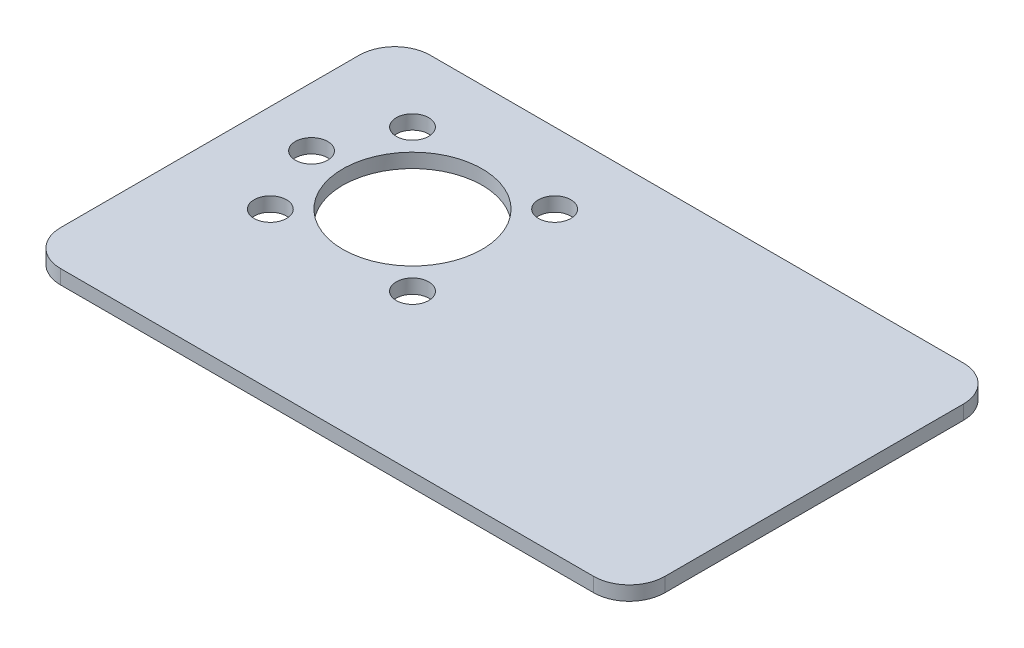
ISO-10303-21;
HEADER;
FILE_DESCRIPTION(('STEP AP214'),'2;1');
FILE_NAME('part.step','',(''),(''),'','','');
FILE_SCHEMA(('AUTOMOTIVE_DESIGN { 1 0 10303 214 1 1 1 1 }'));
ENDSEC;
DATA;
#1=APPLICATION_CONTEXT('core data for automotive mechanical design processes');
#2=APPLICATION_PROTOCOL_DEFINITION('international standard','automotive_design',2000,#1);
#3=PRODUCT_CONTEXT('',#1,'mechanical');
#4=PRODUCT('Part','Part','',(#3));
#5=PRODUCT_RELATED_PRODUCT_CATEGORY('part','',(#4));
#6=PRODUCT_DEFINITION_FORMATION('','',#4);
#7=PRODUCT_DEFINITION_CONTEXT('part definition',#1,'design');
#8=PRODUCT_DEFINITION('design','',#6,#7);
#9=PRODUCT_DEFINITION_SHAPE('','',#8);
#10=(LENGTH_UNIT() NAMED_UNIT(*) SI_UNIT(.MILLI.,.METRE.));
#11=(NAMED_UNIT(*) PLANE_ANGLE_UNIT() SI_UNIT($,.RADIAN.));
#12=(NAMED_UNIT(*) SI_UNIT($,.STERADIAN.) SOLID_ANGLE_UNIT());
#13=UNCERTAINTY_MEASURE_WITH_UNIT(LENGTH_MEASURE(1.E-05),#10,'distance_accuracy_value','');
#14=(GEOMETRIC_REPRESENTATION_CONTEXT(3) GLOBAL_UNCERTAINTY_ASSIGNED_CONTEXT((#13)) GLOBAL_UNIT_ASSIGNED_CONTEXT((#10,
#11,#12)) REPRESENTATION_CONTEXT('',''));
#15=CARTESIAN_POINT('',(0.,0.,0.));
#16=DIRECTION('',(0.,0.,1.));
#17=DIRECTION('',(1.,0.,0.));
#18=AXIS2_PLACEMENT_3D('',#15,#16,#17);
#19=CARTESIAN_POINT('',(0.,2.54,0.));
#20=DIRECTION('',(0.,-1.,0.));
#21=DIRECTION('',(0.,0.,-1.));
#22=AXIS2_PLACEMENT_3D('',#19,#20,#21);
#23=PLANE('',#22);
#24=CARTESIAN_POINT('',(28.575,2.54,-40.64));
#25=DIRECTION('',(0.,1.,0.));
#26=DIRECTION('',(0.,0.,1.));
#27=AXIS2_PLACEMENT_3D('',#24,#25,#26);
#28=CIRCLE('',#27,12.4587);
#29=CARTESIAN_POINT('',(28.575,2.54,-28.1813));
#30=VERTEX_POINT('',#29);
#31=EDGE_CURVE('E214',#30,#30,#28,.T.);
#32=ORIENTED_EDGE('',*,*,#31,.F.);
#33=EDGE_LOOP('',(#32));
#34=FACE_BOUND('',#33,.T.);
#35=CARTESIAN_POINT('',(15.875,2.54,-53.34));
#36=DIRECTION('',(0.,1.,0.));
#37=DIRECTION('',(0.,0.,1.));
#38=AXIS2_PLACEMENT_3D('',#35,#36,#37);
#39=CIRCLE('',#38,2.9);
#40=CARTESIAN_POINT('',(15.875,2.54,-50.44));
#41=VERTEX_POINT('',#40);
#42=EDGE_CURVE('E208',#41,#41,#39,.T.);
#43=ORIENTED_EDGE('',*,*,#42,.F.);
#44=EDGE_LOOP('',(#43));
#45=FACE_BOUND('',#44,.T.);
#46=DIRECTION('',(0.,0.,1.));
#47=VECTOR('',#46,1.);
#48=CARTESIAN_POINT('',(0.,2.54,0.));
#49=LINE('',#48,#47);
#50=CARTESIAN_POINT('',(0.,2.54,-59.69));
#51=VERTEX_POINT('',#50);
#52=CARTESIAN_POINT('',(0.,2.54,-6.35));
#53=VERTEX_POINT('',#52);
#54=EDGE_CURVE('E142',#51,#53,#49,.T.);
#55=ORIENTED_EDGE('',*,*,#54,.T.);
#56=CARTESIAN_POINT('',(6.35,2.54,-6.35));
#57=DIRECTION('',(0.,-1.,0.));
#58=DIRECTION('',(0.,0.,-1.));
#59=AXIS2_PLACEMENT_3D('',#56,#57,#58);
#60=CIRCLE('',#59,6.35);
#61=CARTESIAN_POINT('',(6.35,2.54,0.));
#62=VERTEX_POINT('',#61);
#63=EDGE_CURVE('E157',#53,#62,#60,.F.);
#64=ORIENTED_EDGE('',*,*,#63,.T.);
#65=DIRECTION('',(1.,0.,0.));
#66=VECTOR('',#65,1.);
#67=CARTESIAN_POINT('',(0.,2.54,0.));
#68=LINE('',#67,#66);
#69=CARTESIAN_POINT('',(101.6,2.54,0.));
#70=VERTEX_POINT('',#69);
#71=EDGE_CURVE('E125',#62,#70,#68,.T.);
#72=ORIENTED_EDGE('',*,*,#71,.T.);
#73=CARTESIAN_POINT('',(101.6,2.54,-6.35));
#74=DIRECTION('',(0.,-1.,0.));
#75=DIRECTION('',(0.,0.,-1.));
#76=AXIS2_PLACEMENT_3D('',#73,#74,#75);
#77=CIRCLE('',#76,6.35);
#78=CARTESIAN_POINT('',(107.95,2.54,-6.35));
#79=VERTEX_POINT('',#78);
#80=EDGE_CURVE('E155',#70,#79,#77,.F.);
#81=ORIENTED_EDGE('',*,*,#80,.T.);
#82=DIRECTION('',(0.,0.,-1.));
#83=VECTOR('',#82,1.);
#84=CARTESIAN_POINT('',(107.95,2.54,0.));
#85=LINE('',#84,#83);
#86=CARTESIAN_POINT('',(107.95,2.54,-59.69));
#87=VERTEX_POINT('',#86);
#88=EDGE_CURVE('E168',#79,#87,#85,.T.);
#89=ORIENTED_EDGE('',*,*,#88,.T.);
#90=CARTESIAN_POINT('',(101.6,2.54,-59.69));
#91=DIRECTION('',(0.,-1.,0.));
#92=DIRECTION('',(0.,0.,-1.));
#93=AXIS2_PLACEMENT_3D('',#90,#91,#92);
#94=CIRCLE('',#93,6.35);
#95=CARTESIAN_POINT('',(101.6,2.54,-66.04));
#96=VERTEX_POINT('',#95);
#97=EDGE_CURVE('E60',#87,#96,#94,.F.);
#98=ORIENTED_EDGE('',*,*,#97,.T.);
#99=DIRECTION('',(-1.,0.,0.));
#100=VECTOR('',#99,1.);
#101=CARTESIAN_POINT('',(0.,2.54,-66.04));
#102=LINE('',#101,#100);
#103=CARTESIAN_POINT('',(6.35,2.54,-66.04));
#104=VERTEX_POINT('',#103);
#105=EDGE_CURVE('E143',#96,#104,#102,.T.);
#106=ORIENTED_EDGE('',*,*,#105,.T.);
#107=CARTESIAN_POINT('',(6.35,2.54,-59.69));
#108=DIRECTION('',(0.,-1.,0.));
#109=DIRECTION('',(0.,0.,-1.));
#110=AXIS2_PLACEMENT_3D('',#107,#108,#109);
#111=CIRCLE('',#110,6.35);
#112=EDGE_CURVE('E152',#104,#51,#111,.F.);
#113=ORIENTED_EDGE('',*,*,#112,.T.);
#114=EDGE_LOOP('',(#55,#64,#72,#81,#89,#98,#106,#113));
#115=FACE_BOUND('',#114,.T.);
#116=CARTESIAN_POINT('',(10.541,2.54,-40.64));
#117=DIRECTION('',(0.,1.,0.));
#118=DIRECTION('',(0.,0.,1.));
#119=AXIS2_PLACEMENT_3D('',#116,#117,#118);
#120=CIRCLE('',#119,2.9);
#121=CARTESIAN_POINT('',(10.541,2.54,-37.74));
#122=VERTEX_POINT('',#121);
#123=EDGE_CURVE('E184',#122,#122,#120,.T.);
#124=ORIENTED_EDGE('',*,*,#123,.F.);
#125=EDGE_LOOP('',(#124));
#126=FACE_BOUND('',#125,.T.);
#127=CARTESIAN_POINT('',(15.875,2.54,-27.94));
#128=DIRECTION('',(0.,1.,0.));
#129=DIRECTION('',(0.,0.,1.));
#130=AXIS2_PLACEMENT_3D('',#127,#128,#129);
#131=CIRCLE('',#130,2.9);
#132=CARTESIAN_POINT('',(15.875,2.54,-25.04));
#133=VERTEX_POINT('',#132);
#134=EDGE_CURVE('E190',#133,#133,#131,.T.);
#135=ORIENTED_EDGE('',*,*,#134,.F.);
#136=EDGE_LOOP('',(#135));
#137=FACE_BOUND('',#136,.T.);
#138=CARTESIAN_POINT('',(41.275,2.54,-27.94));
#139=DIRECTION('',(0.,1.,0.));
#140=DIRECTION('',(0.,0.,1.));
#141=AXIS2_PLACEMENT_3D('',#138,#139,#140);
#142=CIRCLE('',#141,2.9);
#143=CARTESIAN_POINT('',(41.275,2.54,-25.04));
#144=VERTEX_POINT('',#143);
#145=EDGE_CURVE('E196',#144,#144,#142,.T.);
#146=ORIENTED_EDGE('',*,*,#145,.F.);
#147=EDGE_LOOP('',(#146));
#148=FACE_BOUND('',#147,.T.);
#149=CARTESIAN_POINT('',(41.275,2.54,-53.34));
#150=DIRECTION('',(0.,1.,0.));
#151=DIRECTION('',(0.,0.,1.));
#152=AXIS2_PLACEMENT_3D('',#149,#150,#151);
#153=CIRCLE('',#152,2.9);
#154=CARTESIAN_POINT('',(41.275,2.54,-50.44));
#155=VERTEX_POINT('',#154);
#156=EDGE_CURVE('E202',#155,#155,#153,.T.);
#157=ORIENTED_EDGE('',*,*,#156,.F.);
#158=EDGE_LOOP('',(#157));
#159=FACE_BOUND('',#158,.T.);
#160=ADVANCED_FACE('F39',(#34,#45,#115,#126,#137,#148,#159),#23,.F.);
#161=CARTESIAN_POINT('',(0.,2.54,0.));
#162=DIRECTION('',(1.,0.,0.));
#163=DIRECTION('',(0.,0.,-1.));
#164=AXIS2_PLACEMENT_3D('',#161,#162,#163);
#165=PLANE('',#164);
#166=DIRECTION('',(0.,0.,1.));
#167=VECTOR('',#166,1.);
#168=CARTESIAN_POINT('',(0.,0.,0.));
#169=LINE('',#168,#167);
#170=CARTESIAN_POINT('',(0.,0.,-59.69));
#171=VERTEX_POINT('',#170);
#172=CARTESIAN_POINT('',(0.,0.,-6.35));
#173=VERTEX_POINT('',#172);
#174=EDGE_CURVE('E132',#171,#173,#169,.T.);
#175=ORIENTED_EDGE('',*,*,#174,.T.);
#176=DIRECTION('',(0.,-1.,0.));
#177=VECTOR('',#176,1.);
#178=CARTESIAN_POINT('',(0.,2.54,-6.35));
#179=LINE('',#178,#177);
#180=EDGE_CURVE('E110',#173,#53,#179,.F.);
#181=ORIENTED_EDGE('',*,*,#180,.T.);
#182=ORIENTED_EDGE('',*,*,#54,.F.);
#183=DIRECTION('',(0.,-1.,0.));
#184=VECTOR('',#183,1.);
#185=CARTESIAN_POINT('',(0.,2.54,-59.69));
#186=LINE('',#185,#184);
#187=EDGE_CURVE('E115',#51,#171,#186,.T.);
#188=ORIENTED_EDGE('',*,*,#187,.T.);
#189=EDGE_LOOP('',(#175,#181,#182,#188));
#190=FACE_BOUND('',#189,.T.);
#191=ADVANCED_FACE('F223',(#190),#165,.F.);
#192=CARTESIAN_POINT('',(0.,2.54,0.));
#193=DIRECTION('',(0.,0.,-1.));
#194=DIRECTION('',(-1.,0.,0.));
#195=AXIS2_PLACEMENT_3D('',#192,#193,#194);
#196=PLANE('',#195);
#197=ORIENTED_EDGE('',*,*,#71,.F.);
#198=DIRECTION('',(0.,-1.,0.));
#199=VECTOR('',#198,1.);
#200=CARTESIAN_POINT('',(6.35,2.54,0.));
#201=LINE('',#200,#199);
#202=CARTESIAN_POINT('',(6.35,0.,0.));
#203=VERTEX_POINT('',#202);
#204=EDGE_CURVE('E109',#62,#203,#201,.T.);
#205=ORIENTED_EDGE('',*,*,#204,.T.);
#206=DIRECTION('',(1.,0.,0.));
#207=VECTOR('',#206,1.);
#208=CARTESIAN_POINT('',(0.,0.,0.));
#209=LINE('',#208,#207);
#210=CARTESIAN_POINT('',(101.6,0.,0.));
#211=VERTEX_POINT('',#210);
#212=EDGE_CURVE('E122',#203,#211,#209,.T.);
#213=ORIENTED_EDGE('',*,*,#212,.T.);
#214=DIRECTION('',(0.,-1.,0.));
#215=VECTOR('',#214,1.);
#216=CARTESIAN_POINT('',(101.6,2.54,0.));
#217=LINE('',#216,#215);
#218=EDGE_CURVE('E127',#211,#70,#217,.F.);
#219=ORIENTED_EDGE('',*,*,#218,.T.);
#220=EDGE_LOOP('',(#197,#205,#213,#219));
#221=FACE_BOUND('',#220,.T.);
#222=ADVANCED_FACE('F121',(#221),#196,.F.);
#223=CARTESIAN_POINT('',(107.95,2.54,0.));
#224=DIRECTION('',(-1.,0.,0.));
#225=DIRECTION('',(0.,0.,1.));
#226=AXIS2_PLACEMENT_3D('',#223,#224,#225);
#227=PLANE('',#226);
#228=ORIENTED_EDGE('',*,*,#88,.F.);
#229=DIRECTION('',(0.,-1.,0.));
#230=VECTOR('',#229,1.);
#231=CARTESIAN_POINT('',(107.95,2.54,-6.35));
#232=LINE('',#231,#230);
#233=CARTESIAN_POINT('',(107.95,0.,-6.35));
#234=VERTEX_POINT('',#233);
#235=EDGE_CURVE('E161',#79,#234,#232,.T.);
#236=ORIENTED_EDGE('',*,*,#235,.T.);
#237=DIRECTION('',(0.,0.,-1.));
#238=VECTOR('',#237,1.);
#239=CARTESIAN_POINT('',(107.95,0.,0.));
#240=LINE('',#239,#238);
#241=CARTESIAN_POINT('',(107.95,0.,-59.69));
#242=VERTEX_POINT('',#241);
#243=EDGE_CURVE('E131',#234,#242,#240,.T.);
#244=ORIENTED_EDGE('',*,*,#243,.T.);
#245=DIRECTION('',(0.,-1.,0.));
#246=VECTOR('',#245,1.);
#247=CARTESIAN_POINT('',(107.95,2.54,-59.69));
#248=LINE('',#247,#246);
#249=EDGE_CURVE('E159',#242,#87,#248,.F.);
#250=ORIENTED_EDGE('',*,*,#249,.T.);
#251=EDGE_LOOP('',(#228,#236,#244,#250));
#252=FACE_BOUND('',#251,.T.);
#253=ADVANCED_FACE('F166',(#252),#227,.F.);
#254=CARTESIAN_POINT('',(0.,2.54,-66.04));
#255=DIRECTION('',(0.,0.,1.));
#256=DIRECTION('',(1.,0.,0.));
#257=AXIS2_PLACEMENT_3D('',#254,#255,#256);
#258=PLANE('',#257);
#259=ORIENTED_EDGE('',*,*,#105,.F.);
#260=DIRECTION('',(0.,-1.,0.));
#261=VECTOR('',#260,1.);
#262=CARTESIAN_POINT('',(101.6,2.54,-66.04));
#263=LINE('',#262,#261);
#264=CARTESIAN_POINT('',(101.6,0.,-66.04));
#265=VERTEX_POINT('',#264);
#266=EDGE_CURVE('E11',#96,#265,#263,.T.);
#267=ORIENTED_EDGE('',*,*,#266,.T.);
#268=DIRECTION('',(-1.,0.,0.));
#269=VECTOR('',#268,1.);
#270=CARTESIAN_POINT('',(0.,0.,-66.04));
#271=LINE('',#270,#269);
#272=CARTESIAN_POINT('',(6.35,0.,-66.04));
#273=VERTEX_POINT('',#272);
#274=EDGE_CURVE('E135',#265,#273,#271,.T.);
#275=ORIENTED_EDGE('',*,*,#274,.T.);
#276=DIRECTION('',(0.,-1.,0.));
#277=VECTOR('',#276,1.);
#278=CARTESIAN_POINT('',(6.35,2.54,-66.04));
#279=LINE('',#278,#277);
#280=EDGE_CURVE('E47',#273,#104,#279,.F.);
#281=ORIENTED_EDGE('',*,*,#280,.T.);
#282=EDGE_LOOP('',(#259,#267,#275,#281));
#283=FACE_BOUND('',#282,.T.);
#284=ADVANCED_FACE('F175',(#283),#258,.F.);
#285=CARTESIAN_POINT('',(0.,0.,0.));
#286=DIRECTION('',(0.,-1.,0.));
#287=DIRECTION('',(0.,0.,-1.));
#288=AXIS2_PLACEMENT_3D('',#285,#286,#287);
#289=PLANE('',#288);
#290=CARTESIAN_POINT('',(28.575,0.,-40.64));
#291=DIRECTION('',(0.,-1.,0.));
#292=DIRECTION('',(0.,0.,-1.));
#293=AXIS2_PLACEMENT_3D('',#290,#291,#292);
#294=CIRCLE('',#293,12.4587);
#295=CARTESIAN_POINT('',(28.575,0.,-53.0987));
#296=VERTEX_POINT('',#295);
#297=EDGE_CURVE('E211',#296,#296,#294,.T.);
#298=ORIENTED_EDGE('',*,*,#297,.F.);
#299=EDGE_LOOP('',(#298));
#300=FACE_BOUND('',#299,.T.);
#301=CARTESIAN_POINT('',(15.875,0.,-53.34));
#302=DIRECTION('',(0.,-1.,0.));
#303=DIRECTION('',(0.,0.,-1.));
#304=AXIS2_PLACEMENT_3D('',#301,#302,#303);
#305=CIRCLE('',#304,2.9);
#306=CARTESIAN_POINT('',(15.875,0.,-56.24));
#307=VERTEX_POINT('',#306);
#308=EDGE_CURVE('E205',#307,#307,#305,.T.);
#309=ORIENTED_EDGE('',*,*,#308,.F.);
#310=EDGE_LOOP('',(#309));
#311=FACE_BOUND('',#310,.T.);
#312=CARTESIAN_POINT('',(41.275,0.,-53.34));
#313=DIRECTION('',(0.,-1.,0.));
#314=DIRECTION('',(0.,0.,-1.));
#315=AXIS2_PLACEMENT_3D('',#312,#313,#314);
#316=CIRCLE('',#315,2.9);
#317=CARTESIAN_POINT('',(41.275,0.,-56.24));
#318=VERTEX_POINT('',#317);
#319=EDGE_CURVE('E199',#318,#318,#316,.T.);
#320=ORIENTED_EDGE('',*,*,#319,.F.);
#321=EDGE_LOOP('',(#320));
#322=FACE_BOUND('',#321,.T.);
#323=CARTESIAN_POINT('',(41.275,0.,-27.94));
#324=DIRECTION('',(0.,-1.,0.));
#325=DIRECTION('',(0.,0.,-1.));
#326=AXIS2_PLACEMENT_3D('',#323,#324,#325);
#327=CIRCLE('',#326,2.9);
#328=CARTESIAN_POINT('',(41.275,0.,-30.84));
#329=VERTEX_POINT('',#328);
#330=EDGE_CURVE('E193',#329,#329,#327,.T.);
#331=ORIENTED_EDGE('',*,*,#330,.F.);
#332=EDGE_LOOP('',(#331));
#333=FACE_BOUND('',#332,.T.);
#334=CARTESIAN_POINT('',(15.875,0.,-27.94));
#335=DIRECTION('',(0.,-1.,0.));
#336=DIRECTION('',(0.,0.,-1.));
#337=AXIS2_PLACEMENT_3D('',#334,#335,#336);
#338=CIRCLE('',#337,2.9);
#339=CARTESIAN_POINT('',(15.875,0.,-30.84));
#340=VERTEX_POINT('',#339);
#341=EDGE_CURVE('E187',#340,#340,#338,.T.);
#342=ORIENTED_EDGE('',*,*,#341,.F.);
#343=EDGE_LOOP('',(#342));
#344=FACE_BOUND('',#343,.T.);
#345=CARTESIAN_POINT('',(10.541,0.,-40.64));
#346=DIRECTION('',(0.,-1.,0.));
#347=DIRECTION('',(0.,0.,-1.));
#348=AXIS2_PLACEMENT_3D('',#345,#346,#347);
#349=CIRCLE('',#348,2.9);
#350=CARTESIAN_POINT('',(10.541,0.,-43.54));
#351=VERTEX_POINT('',#350);
#352=EDGE_CURVE('E137',#351,#351,#349,.T.);
#353=ORIENTED_EDGE('',*,*,#352,.F.);
#354=EDGE_LOOP('',(#353));
#355=FACE_BOUND('',#354,.T.);
#356=ORIENTED_EDGE('',*,*,#212,.F.);
#357=CARTESIAN_POINT('',(6.35,0.,-6.35));
#358=DIRECTION('',(0.,-1.,0.));
#359=DIRECTION('',(0.,0.,-1.));
#360=AXIS2_PLACEMENT_3D('',#357,#358,#359);
#361=CIRCLE('',#360,6.35);
#362=EDGE_CURVE('E105',#203,#173,#361,.T.);
#363=ORIENTED_EDGE('',*,*,#362,.T.);
#364=ORIENTED_EDGE('',*,*,#174,.F.);
#365=CARTESIAN_POINT('',(6.35,0.,-59.69));
#366=DIRECTION('',(0.,-1.,0.));
#367=DIRECTION('',(0.,0.,-1.));
#368=AXIS2_PLACEMENT_3D('',#365,#366,#367);
#369=CIRCLE('',#368,6.35);
#370=EDGE_CURVE('E126',#171,#273,#369,.T.);
#371=ORIENTED_EDGE('',*,*,#370,.T.);
#372=ORIENTED_EDGE('',*,*,#274,.F.);
#373=CARTESIAN_POINT('',(101.6,0.,-59.69));
#374=DIRECTION('',(0.,-1.,0.));
#375=DIRECTION('',(0.,0.,-1.));
#376=AXIS2_PLACEMENT_3D('',#373,#374,#375);
#377=CIRCLE('',#376,6.35);
#378=EDGE_CURVE('E146',#265,#242,#377,.T.);
#379=ORIENTED_EDGE('',*,*,#378,.T.);
#380=ORIENTED_EDGE('',*,*,#243,.F.);
#381=CARTESIAN_POINT('',(101.6,0.,-6.35));
#382=DIRECTION('',(0.,-1.,0.));
#383=DIRECTION('',(0.,0.,-1.));
#384=AXIS2_PLACEMENT_3D('',#381,#382,#383);
#385=CIRCLE('',#384,6.35);
#386=EDGE_CURVE('E116',#234,#211,#385,.T.);
#387=ORIENTED_EDGE('',*,*,#386,.T.);
#388=EDGE_LOOP('',(#356,#363,#364,#371,#372,#379,#380,#387));
#389=FACE_BOUND('',#388,.T.);
#390=ADVANCED_FACE('F129',(#300,#311,#322,#333,#344,#355,#389),#289,.T.);
#391=CARTESIAN_POINT('',(10.541,2.54,-40.64));
#392=DIRECTION('',(0.,1.,0.));
#393=DIRECTION('',(0.,0.,1.));
#394=AXIS2_PLACEMENT_3D('',#391,#392,#393);
#395=CYLINDRICAL_SURFACE('',#394,2.9);
#396=ORIENTED_EDGE('',*,*,#123,.T.);
#397=EDGE_LOOP('',(#396));
#398=FACE_BOUND('',#397,.T.);
#399=ORIENTED_EDGE('',*,*,#352,.T.);
#400=EDGE_LOOP('',(#399));
#401=FACE_BOUND('',#400,.T.);
#402=ADVANCED_FACE('F246',(#398,#401),#395,.F.);
#403=CARTESIAN_POINT('',(15.875,2.54,-27.94));
#404=DIRECTION('',(0.,1.,0.));
#405=DIRECTION('',(0.,0.,1.));
#406=AXIS2_PLACEMENT_3D('',#403,#404,#405);
#407=CYLINDRICAL_SURFACE('',#406,2.9);
#408=ORIENTED_EDGE('',*,*,#134,.T.);
#409=EDGE_LOOP('',(#408));
#410=FACE_BOUND('',#409,.T.);
#411=ORIENTED_EDGE('',*,*,#341,.T.);
#412=EDGE_LOOP('',(#411));
#413=FACE_BOUND('',#412,.T.);
#414=ADVANCED_FACE('F256',(#410,#413),#407,.F.);
#415=CARTESIAN_POINT('',(41.275,2.54,-27.94));
#416=DIRECTION('',(0.,1.,0.));
#417=DIRECTION('',(0.,0.,1.));
#418=AXIS2_PLACEMENT_3D('',#415,#416,#417);
#419=CYLINDRICAL_SURFACE('',#418,2.9);
#420=ORIENTED_EDGE('',*,*,#145,.T.);
#421=EDGE_LOOP('',(#420));
#422=FACE_BOUND('',#421,.T.);
#423=ORIENTED_EDGE('',*,*,#330,.T.);
#424=EDGE_LOOP('',(#423));
#425=FACE_BOUND('',#424,.T.);
#426=ADVANCED_FACE('F240',(#422,#425),#419,.F.);
#427=CARTESIAN_POINT('',(41.275,2.54,-53.34));
#428=DIRECTION('',(0.,1.,0.));
#429=DIRECTION('',(0.,0.,1.));
#430=AXIS2_PLACEMENT_3D('',#427,#428,#429);
#431=CYLINDRICAL_SURFACE('',#430,2.9);
#432=ORIENTED_EDGE('',*,*,#156,.T.);
#433=EDGE_LOOP('',(#432));
#434=FACE_BOUND('',#433,.T.);
#435=ORIENTED_EDGE('',*,*,#319,.T.);
#436=EDGE_LOOP('',(#435));
#437=FACE_BOUND('',#436,.T.);
#438=ADVANCED_FACE('F236',(#434,#437),#431,.F.);
#439=CARTESIAN_POINT('',(15.875,2.54,-53.34));
#440=DIRECTION('',(0.,1.,0.));
#441=DIRECTION('',(0.,0.,1.));
#442=AXIS2_PLACEMENT_3D('',#439,#440,#441);
#443=CYLINDRICAL_SURFACE('',#442,2.9);
#444=ORIENTED_EDGE('',*,*,#42,.T.);
#445=EDGE_LOOP('',(#444));
#446=FACE_BOUND('',#445,.T.);
#447=ORIENTED_EDGE('',*,*,#308,.T.);
#448=EDGE_LOOP('',(#447));
#449=FACE_BOUND('',#448,.T.);
#450=ADVANCED_FACE('F239',(#446,#449),#443,.F.);
#451=CARTESIAN_POINT('',(28.575,2.54,-40.64));
#452=DIRECTION('',(0.,1.,0.));
#453=DIRECTION('',(0.,0.,1.));
#454=AXIS2_PLACEMENT_3D('',#451,#452,#453);
#455=CYLINDRICAL_SURFACE('',#454,12.4587);
#456=ORIENTED_EDGE('',*,*,#31,.T.);
#457=EDGE_LOOP('',(#456));
#458=FACE_BOUND('',#457,.T.);
#459=ORIENTED_EDGE('',*,*,#297,.T.);
#460=EDGE_LOOP('',(#459));
#461=FACE_BOUND('',#460,.T.);
#462=ADVANCED_FACE('F218',(#458,#461),#455,.F.);
#463=CARTESIAN_POINT('',(6.35,2.54,-6.35));
#464=DIRECTION('',(0.,-1.,0.));
#465=DIRECTION('',(0.,0.,-1.));
#466=AXIS2_PLACEMENT_3D('',#463,#464,#465);
#467=CYLINDRICAL_SURFACE('',#466,6.35);
#468=ORIENTED_EDGE('',*,*,#63,.F.);
#469=ORIENTED_EDGE('',*,*,#180,.F.);
#470=ORIENTED_EDGE('',*,*,#362,.F.);
#471=ORIENTED_EDGE('',*,*,#204,.F.);
#472=EDGE_LOOP('',(#468,#469,#470,#471));
#473=FACE_BOUND('',#472,.T.);
#474=ADVANCED_FACE('F108',(#473),#467,.T.);
#475=CARTESIAN_POINT('',(101.6,2.54,-6.35));
#476=DIRECTION('',(0.,-1.,0.));
#477=DIRECTION('',(0.,0.,-1.));
#478=AXIS2_PLACEMENT_3D('',#475,#476,#477);
#479=CYLINDRICAL_SURFACE('',#478,6.35);
#480=ORIENTED_EDGE('',*,*,#80,.F.);
#481=ORIENTED_EDGE('',*,*,#218,.F.);
#482=ORIENTED_EDGE('',*,*,#386,.F.);
#483=ORIENTED_EDGE('',*,*,#235,.F.);
#484=EDGE_LOOP('',(#480,#481,#482,#483));
#485=FACE_BOUND('',#484,.T.);
#486=ADVANCED_FACE('F277',(#485),#479,.T.);
#487=CARTESIAN_POINT('',(101.6,2.54,-59.69));
#488=DIRECTION('',(0.,-1.,0.));
#489=DIRECTION('',(0.,0.,-1.));
#490=AXIS2_PLACEMENT_3D('',#487,#488,#489);
#491=CYLINDRICAL_SURFACE('',#490,6.35);
#492=ORIENTED_EDGE('',*,*,#97,.F.);
#493=ORIENTED_EDGE('',*,*,#249,.F.);
#494=ORIENTED_EDGE('',*,*,#378,.F.);
#495=ORIENTED_EDGE('',*,*,#266,.F.);
#496=EDGE_LOOP('',(#492,#493,#494,#495));
#497=FACE_BOUND('',#496,.T.);
#498=ADVANCED_FACE('F174',(#497),#491,.T.);
#499=CARTESIAN_POINT('',(6.35,2.54,-59.69));
#500=DIRECTION('',(0.,-1.,0.));
#501=DIRECTION('',(0.,0.,-1.));
#502=AXIS2_PLACEMENT_3D('',#499,#500,#501);
#503=CYLINDRICAL_SURFACE('',#502,6.35);
#504=ORIENTED_EDGE('',*,*,#112,.F.);
#505=ORIENTED_EDGE('',*,*,#280,.F.);
#506=ORIENTED_EDGE('',*,*,#370,.F.);
#507=ORIENTED_EDGE('',*,*,#187,.F.);
#508=EDGE_LOOP('',(#504,#505,#506,#507));
#509=FACE_BOUND('',#508,.T.);
#510=ADVANCED_FACE('F41',(#509),#503,.T.);
#511=CLOSED_SHELL('',(#160,#191,#222,#253,#284,#390,#402,#414,#426,#438,#450,#462,#474,#486,
#498,#510));
#512=MANIFOLD_SOLID_BREP('B2',#511);
#513=ADVANCED_BREP_SHAPE_REPRESENTATION('',(#18,#512),#14);
#514=SHAPE_DEFINITION_REPRESENTATION(#9,#513);
ENDSEC;
END-ISO-10303-21;
